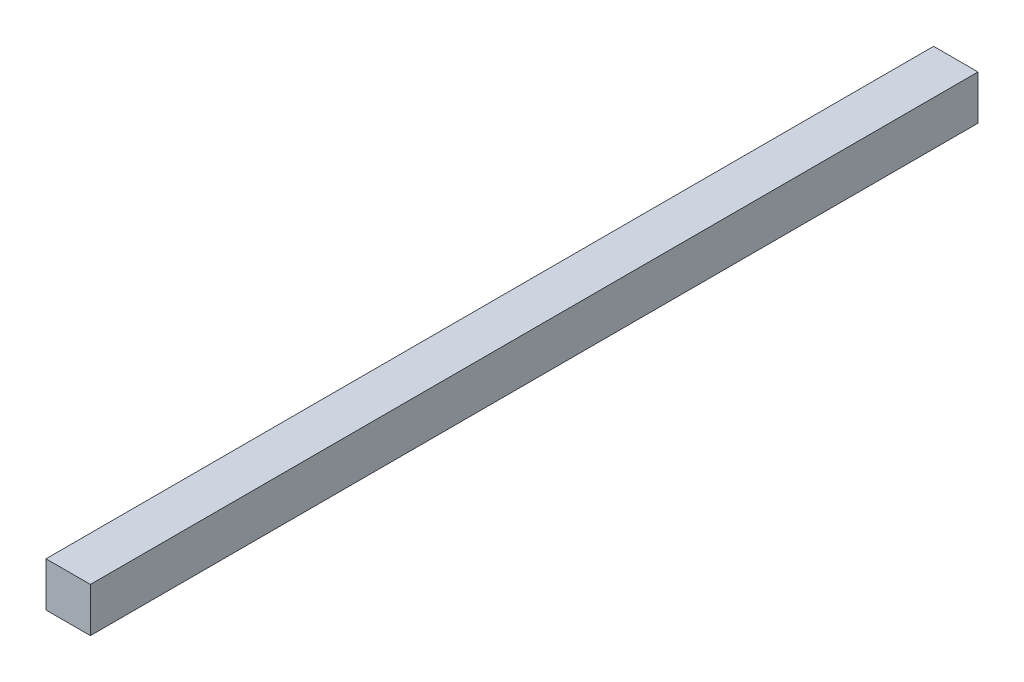
ISO-10303-21;
HEADER;
FILE_DESCRIPTION(('STEP AP214'),'2;1');
FILE_NAME('part.step','',(''),(''),'','','');
FILE_SCHEMA(('AUTOMOTIVE_DESIGN { 1 0 10303 214 1 1 1 1 }'));
ENDSEC;
DATA;
#1=APPLICATION_CONTEXT('core data for automotive mechanical design processes');
#2=APPLICATION_PROTOCOL_DEFINITION('international standard','automotive_design',2000,#1);
#3=PRODUCT_CONTEXT('',#1,'mechanical');
#4=PRODUCT('Part','Part','',(#3));
#5=PRODUCT_RELATED_PRODUCT_CATEGORY('part','',(#4));
#6=PRODUCT_DEFINITION_FORMATION('','',#4);
#7=PRODUCT_DEFINITION_CONTEXT('part definition',#1,'design');
#8=PRODUCT_DEFINITION('design','',#6,#7);
#9=PRODUCT_DEFINITION_SHAPE('','',#8);
#10=(LENGTH_UNIT() NAMED_UNIT(*) SI_UNIT(.MILLI.,.METRE.));
#11=(NAMED_UNIT(*) PLANE_ANGLE_UNIT() SI_UNIT($,.RADIAN.));
#12=(NAMED_UNIT(*) SI_UNIT($,.STERADIAN.) SOLID_ANGLE_UNIT());
#13=UNCERTAINTY_MEASURE_WITH_UNIT(LENGTH_MEASURE(1.E-05),#10,'distance_accuracy_value','');
#14=(GEOMETRIC_REPRESENTATION_CONTEXT(3) GLOBAL_UNCERTAINTY_ASSIGNED_CONTEXT((#13)) GLOBAL_UNIT_ASSIGNED_CONTEXT((#10,
#11,#12)) REPRESENTATION_CONTEXT('',''));
#15=CARTESIAN_POINT('',(0.,0.,0.));
#16=DIRECTION('',(0.,0.,1.));
#17=DIRECTION('',(1.,0.,0.));
#18=AXIS2_PLACEMENT_3D('',#15,#16,#17);
#19=CARTESIAN_POINT('',(-115.,230.,4600.));
#20=DIRECTION('',(1.,0.,0.));
#21=DIRECTION('',(0.,1.,0.));
#22=AXIS2_PLACEMENT_3D('',#19,#20,#21);
#23=PLANE('',#22);
#24=DIRECTION('',(0.,-1.,0.));
#25=VECTOR('',#24,1.);
#26=CARTESIAN_POINT('',(-115.,230.,0.));
#27=LINE('',#26,#25);
#28=CARTESIAN_POINT('',(-115.,230.,0.));
#29=VERTEX_POINT('',#28);
#30=CARTESIAN_POINT('',(-115.,0.,0.));
#31=VERTEX_POINT('',#30);
#32=EDGE_CURVE('E133',#29,#31,#27,.T.);
#33=ORIENTED_EDGE('',*,*,#32,.T.);
#34=DIRECTION('',(0.,0.,-1.));
#35=VECTOR('',#34,1.);
#36=CARTESIAN_POINT('',(-115.,0.,4600.));
#37=LINE('',#36,#35);
#38=CARTESIAN_POINT('',(-115.,0.,4600.));
#39=VERTEX_POINT('',#38);
#40=EDGE_CURVE('E169',#39,#31,#37,.T.);
#41=ORIENTED_EDGE('',*,*,#40,.F.);
#42=DIRECTION('',(0.,-1.,0.));
#43=VECTOR('',#42,1.);
#44=CARTESIAN_POINT('',(-115.,230.,4600.));
#45=LINE('',#44,#43);
#46=CARTESIAN_POINT('',(-115.,230.,4600.));
#47=VERTEX_POINT('',#46);
#48=EDGE_CURVE('E153',#47,#39,#45,.T.);
#49=ORIENTED_EDGE('',*,*,#48,.F.);
#50=DIRECTION('',(0.,0.,-1.));
#51=VECTOR('',#50,1.);
#52=CARTESIAN_POINT('',(-115.,230.,4600.));
#53=LINE('',#52,#51);
#54=EDGE_CURVE('E158',#47,#29,#53,.T.);
#55=ORIENTED_EDGE('',*,*,#54,.T.);
#56=EDGE_LOOP('',(#33,#41,#49,#55));
#57=FACE_BOUND('',#56,.T.);
#58=ADVANCED_FACE('F35',(#57),#23,.F.);
#59=CARTESIAN_POINT('',(-115.,0.,4600.));
#60=DIRECTION('',(0.,1.,0.));
#61=DIRECTION('',(0.,0.,1.));
#62=AXIS2_PLACEMENT_3D('',#59,#60,#61);
#63=PLANE('',#62);
#64=DIRECTION('',(1.,0.,0.));
#65=VECTOR('',#64,1.);
#66=CARTESIAN_POINT('',(-115.,0.,0.));
#67=LINE('',#66,#65);
#68=CARTESIAN_POINT('',(115.,0.,0.));
#69=VERTEX_POINT('',#68);
#70=EDGE_CURVE('E137',#31,#69,#67,.T.);
#71=ORIENTED_EDGE('',*,*,#70,.T.);
#72=DIRECTION('',(0.,0.,-1.));
#73=VECTOR('',#72,1.);
#74=CARTESIAN_POINT('',(115.,0.,4600.));
#75=LINE('',#74,#73);
#76=CARTESIAN_POINT('',(115.,0.,4600.));
#77=VERTEX_POINT('',#76);
#78=EDGE_CURVE('E167',#77,#69,#75,.T.);
#79=ORIENTED_EDGE('',*,*,#78,.F.);
#80=DIRECTION('',(1.,0.,0.));
#81=VECTOR('',#80,1.);
#82=CARTESIAN_POINT('',(-115.,0.,4600.));
#83=LINE('',#82,#81);
#84=EDGE_CURVE('E88',#39,#77,#83,.T.);
#85=ORIENTED_EDGE('',*,*,#84,.F.);
#86=ORIENTED_EDGE('',*,*,#40,.T.);
#87=EDGE_LOOP('',(#71,#79,#85,#86));
#88=FACE_BOUND('',#87,.T.);
#89=ADVANCED_FACE('F188',(#88),#63,.F.);
#90=CARTESIAN_POINT('',(115.,230.,4600.));
#91=DIRECTION('',(-1.,0.,0.));
#92=DIRECTION('',(0.,-1.,0.));
#93=AXIS2_PLACEMENT_3D('',#90,#91,#92);
#94=PLANE('',#93);
#95=DIRECTION('',(0.,1.,0.));
#96=VECTOR('',#95,1.);
#97=CARTESIAN_POINT('',(115.,230.,0.));
#98=LINE('',#97,#96);
#99=CARTESIAN_POINT('',(115.,230.,0.));
#100=VERTEX_POINT('',#99);
#101=EDGE_CURVE('E161',#69,#100,#98,.T.);
#102=ORIENTED_EDGE('',*,*,#101,.T.);
#103=DIRECTION('',(0.,0.,-1.));
#104=VECTOR('',#103,1.);
#105=CARTESIAN_POINT('',(115.,230.,4600.));
#106=LINE('',#105,#104);
#107=CARTESIAN_POINT('',(115.,230.,4600.));
#108=VERTEX_POINT('',#107);
#109=EDGE_CURVE('E165',#108,#100,#106,.T.);
#110=ORIENTED_EDGE('',*,*,#109,.F.);
#111=DIRECTION('',(0.,1.,0.));
#112=VECTOR('',#111,1.);
#113=CARTESIAN_POINT('',(115.,230.,4600.));
#114=LINE('',#113,#112);
#115=EDGE_CURVE('E156',#77,#108,#114,.T.);
#116=ORIENTED_EDGE('',*,*,#115,.F.);
#117=ORIENTED_EDGE('',*,*,#78,.T.);
#118=EDGE_LOOP('',(#102,#110,#116,#117));
#119=FACE_BOUND('',#118,.T.);
#120=ADVANCED_FACE('F193',(#119),#94,.F.);
#121=CARTESIAN_POINT('',(-115.,230.,4600.));
#122=DIRECTION('',(0.,-1.,0.));
#123=DIRECTION('',(1.,0.,0.));
#124=AXIS2_PLACEMENT_3D('',#121,#122,#123);
#125=PLANE('',#124);
#126=DIRECTION('',(-1.,0.,0.));
#127=VECTOR('',#126,1.);
#128=CARTESIAN_POINT('',(-115.,230.,0.));
#129=LINE('',#128,#127);
#130=EDGE_CURVE('E80',#100,#29,#129,.T.);
#131=ORIENTED_EDGE('',*,*,#130,.T.);
#132=ORIENTED_EDGE('',*,*,#54,.F.);
#133=DIRECTION('',(-1.,0.,0.));
#134=VECTOR('',#133,1.);
#135=CARTESIAN_POINT('',(-115.,230.,4600.));
#136=LINE('',#135,#134);
#137=EDGE_CURVE('E59',#108,#47,#136,.T.);
#138=ORIENTED_EDGE('',*,*,#137,.F.);
#139=ORIENTED_EDGE('',*,*,#109,.T.);
#140=EDGE_LOOP('',(#131,#132,#138,#139));
#141=FACE_BOUND('',#140,.T.);
#142=ADVANCED_FACE('F204',(#141),#125,.F.);
#143=CARTESIAN_POINT('',(0.,0.,4600.));
#144=DIRECTION('',(0.,0.,1.));
#145=DIRECTION('',(1.,0.,0.));
#146=AXIS2_PLACEMENT_3D('',#143,#144,#145);
#147=PLANE('',#146);
#148=ORIENTED_EDGE('',*,*,#48,.T.);
#149=ORIENTED_EDGE('',*,*,#84,.T.);
#150=ORIENTED_EDGE('',*,*,#115,.T.);
#151=ORIENTED_EDGE('',*,*,#137,.T.);
#152=EDGE_LOOP('',(#148,#149,#150,#151));
#153=FACE_BOUND('',#152,.T.);
#154=ADVANCED_FACE('F202',(#153),#147,.T.);
#155=CARTESIAN_POINT('',(0.,0.,0.));
#156=DIRECTION('',(0.,0.,1.));
#157=DIRECTION('',(1.,0.,0.));
#158=AXIS2_PLACEMENT_3D('',#155,#156,#157);
#159=PLANE('',#158);
#160=DIRECTION('',(-1.,0.,0.));
#161=VECTOR('',#160,1.);
#162=CARTESIAN_POINT('',(-115.,210.,0.));
#163=LINE('',#162,#161);
#164=CARTESIAN_POINT('',(95.,210.,0.));
#165=VERTEX_POINT('',#164);
#166=CARTESIAN_POINT('',(-95.,210.,0.));
#167=VERTEX_POINT('',#166);
#168=EDGE_CURVE('E128',#165,#167,#163,.T.);
#169=ORIENTED_EDGE('',*,*,#168,.T.);
#170=DIRECTION('',(0.,-1.,0.));
#171=VECTOR('',#170,1.);
#172=CARTESIAN_POINT('',(-95.,230.,0.));
#173=LINE('',#172,#171);
#174=CARTESIAN_POINT('',(-95.,20.,0.));
#175=VERTEX_POINT('',#174);
#176=EDGE_CURVE('E147',#167,#175,#173,.T.);
#177=ORIENTED_EDGE('',*,*,#176,.T.);
#178=DIRECTION('',(1.,0.,0.));
#179=VECTOR('',#178,1.);
#180=CARTESIAN_POINT('',(-115.,20.,0.));
#181=LINE('',#180,#179);
#182=CARTESIAN_POINT('',(95.,20.,0.));
#183=VERTEX_POINT('',#182);
#184=EDGE_CURVE('E132',#175,#183,#181,.T.);
#185=ORIENTED_EDGE('',*,*,#184,.T.);
#186=DIRECTION('',(0.,1.,0.));
#187=VECTOR('',#186,1.);
#188=CARTESIAN_POINT('',(95.,230.,0.));
#189=LINE('',#188,#187);
#190=EDGE_CURVE('E50',#183,#165,#189,.T.);
#191=ORIENTED_EDGE('',*,*,#190,.T.);
#192=EDGE_LOOP('',(#169,#177,#185,#191));
#193=FACE_BOUND('',#192,.T.);
#194=ORIENTED_EDGE('',*,*,#32,.F.);
#195=ORIENTED_EDGE('',*,*,#130,.F.);
#196=ORIENTED_EDGE('',*,*,#101,.F.);
#197=ORIENTED_EDGE('',*,*,#70,.F.);
#198=EDGE_LOOP('',(#194,#195,#196,#197));
#199=FACE_BOUND('',#198,.T.);
#200=ADVANCED_FACE('F197',(#193,#199),#159,.F.);
#201=CARTESIAN_POINT('',(-95.,230.,4600.));
#202=DIRECTION('',(1.,0.,0.));
#203=DIRECTION('',(0.,1.,0.));
#204=AXIS2_PLACEMENT_3D('',#201,#202,#203);
#205=PLANE('',#204);
#206=CARTESIAN_POINT('',(-95.,115.,4050.));
#207=DIRECTION('',(1.,0.,0.));
#208=DIRECTION('',(0.,1.,0.));
#209=AXIS2_PLACEMENT_3D('',#206,#207,#208);
#210=CIRCLE('',#209,25.0000000000005);
#211=CARTESIAN_POINT('',(-95.,140.,4050.));
#212=VERTEX_POINT('',#211);
#213=EDGE_CURVE('E11',#212,#212,#210,.T.);
#214=ORIENTED_EDGE('',*,*,#213,.F.);
#215=EDGE_LOOP('',(#214));
#216=FACE_BOUND('',#215,.T.);
#217=ORIENTED_EDGE('',*,*,#176,.F.);
#218=DIRECTION('',(0.,0.,-1.));
#219=VECTOR('',#218,1.);
#220=CARTESIAN_POINT('',(-95.,210.,4600.));
#221=LINE('',#220,#219);
#222=CARTESIAN_POINT('',(-95.,210.,4580.));
#223=VERTEX_POINT('',#222);
#224=EDGE_CURVE('E127',#223,#167,#221,.T.);
#225=ORIENTED_EDGE('',*,*,#224,.F.);
#226=DIRECTION('',(0.,-1.,0.));
#227=VECTOR('',#226,1.);
#228=CARTESIAN_POINT('',(-95.,230.,4580.));
#229=LINE('',#228,#227);
#230=CARTESIAN_POINT('',(-95.,20.,4580.));
#231=VERTEX_POINT('',#230);
#232=EDGE_CURVE('E115',#223,#231,#229,.T.);
#233=ORIENTED_EDGE('',*,*,#232,.T.);
#234=DIRECTION('',(0.,0.,-1.));
#235=VECTOR('',#234,1.);
#236=CARTESIAN_POINT('',(-95.,20.,4600.));
#237=LINE('',#236,#235);
#238=EDGE_CURVE('E125',#231,#175,#237,.T.);
#239=ORIENTED_EDGE('',*,*,#238,.T.);
#240=EDGE_LOOP('',(#217,#225,#233,#239));
#241=FACE_BOUND('',#240,.T.);
#242=ADVANCED_FACE('F124',(#216,#241),#205,.T.);
#243=CARTESIAN_POINT('',(-115.,20.,4600.));
#244=DIRECTION('',(0.,1.,0.));
#245=DIRECTION('',(0.,0.,1.));
#246=AXIS2_PLACEMENT_3D('',#243,#244,#245);
#247=PLANE('',#246);
#248=ORIENTED_EDGE('',*,*,#184,.F.);
#249=ORIENTED_EDGE('',*,*,#238,.F.);
#250=DIRECTION('',(1.,0.,0.));
#251=VECTOR('',#250,1.);
#252=CARTESIAN_POINT('',(-115.,20.,4580.));
#253=LINE('',#252,#251);
#254=CARTESIAN_POINT('',(95.,20.,4580.));
#255=VERTEX_POINT('',#254);
#256=EDGE_CURVE('E111',#231,#255,#253,.T.);
#257=ORIENTED_EDGE('',*,*,#256,.T.);
#258=DIRECTION('',(0.,0.,-1.));
#259=VECTOR('',#258,1.);
#260=CARTESIAN_POINT('',(95.,20.,4600.));
#261=LINE('',#260,#259);
#262=EDGE_CURVE('E134',#255,#183,#261,.T.);
#263=ORIENTED_EDGE('',*,*,#262,.T.);
#264=EDGE_LOOP('',(#248,#249,#257,#263));
#265=FACE_BOUND('',#264,.T.);
#266=ADVANCED_FACE('F130',(#265),#247,.T.);
#267=CARTESIAN_POINT('',(95.,230.,4600.));
#268=DIRECTION('',(-1.,0.,0.));
#269=DIRECTION('',(0.,-1.,0.));
#270=AXIS2_PLACEMENT_3D('',#267,#268,#269);
#271=PLANE('',#270);
#272=CARTESIAN_POINT('',(95.,115.,4050.));
#273=DIRECTION('',(-1.,0.,0.));
#274=DIRECTION('',(0.,-1.,0.));
#275=AXIS2_PLACEMENT_3D('',#272,#273,#274);
#276=CIRCLE('',#275,25.0000000000005);
#277=CARTESIAN_POINT('',(95.,89.9999999999995,4050.));
#278=VERTEX_POINT('',#277);
#279=EDGE_CURVE('E38',#278,#278,#276,.T.);
#280=ORIENTED_EDGE('',*,*,#279,.F.);
#281=EDGE_LOOP('',(#280));
#282=FACE_BOUND('',#281,.T.);
#283=ORIENTED_EDGE('',*,*,#190,.F.);
#284=ORIENTED_EDGE('',*,*,#262,.F.);
#285=DIRECTION('',(0.,1.,0.));
#286=VECTOR('',#285,1.);
#287=CARTESIAN_POINT('',(95.,230.,4580.));
#288=LINE('',#287,#286);
#289=CARTESIAN_POINT('',(95.,210.,4580.));
#290=VERTEX_POINT('',#289);
#291=EDGE_CURVE('E116',#255,#290,#288,.T.);
#292=ORIENTED_EDGE('',*,*,#291,.T.);
#293=DIRECTION('',(0.,0.,-1.));
#294=VECTOR('',#293,1.);
#295=CARTESIAN_POINT('',(95.,210.,4600.));
#296=LINE('',#295,#294);
#297=EDGE_CURVE('E139',#290,#165,#296,.T.);
#298=ORIENTED_EDGE('',*,*,#297,.T.);
#299=EDGE_LOOP('',(#283,#284,#292,#298));
#300=FACE_BOUND('',#299,.T.);
#301=ADVANCED_FACE('F176',(#282,#300),#271,.T.);
#302=CARTESIAN_POINT('',(-115.,210.,4600.));
#303=DIRECTION('',(0.,-1.,0.));
#304=DIRECTION('',(1.,0.,0.));
#305=AXIS2_PLACEMENT_3D('',#302,#303,#304);
#306=PLANE('',#305);
#307=ORIENTED_EDGE('',*,*,#168,.F.);
#308=ORIENTED_EDGE('',*,*,#297,.F.);
#309=DIRECTION('',(-1.,0.,0.));
#310=VECTOR('',#309,1.);
#311=CARTESIAN_POINT('',(-115.,210.,4580.));
#312=LINE('',#311,#310);
#313=EDGE_CURVE('E142',#290,#223,#312,.T.);
#314=ORIENTED_EDGE('',*,*,#313,.T.);
#315=ORIENTED_EDGE('',*,*,#224,.T.);
#316=EDGE_LOOP('',(#307,#308,#314,#315));
#317=FACE_BOUND('',#316,.T.);
#318=ADVANCED_FACE('F178',(#317),#306,.T.);
#319=CARTESIAN_POINT('',(0.,0.,4580.));
#320=DIRECTION('',(0.,0.,1.));
#321=DIRECTION('',(1.,0.,0.));
#322=AXIS2_PLACEMENT_3D('',#319,#320,#321);
#323=PLANE('',#322);
#324=ORIENTED_EDGE('',*,*,#232,.F.);
#325=ORIENTED_EDGE('',*,*,#313,.F.);
#326=ORIENTED_EDGE('',*,*,#291,.F.);
#327=ORIENTED_EDGE('',*,*,#256,.F.);
#328=EDGE_LOOP('',(#324,#325,#326,#327));
#329=FACE_BOUND('',#328,.T.);
#330=ADVANCED_FACE('F113',(#329),#323,.F.);
#331=CARTESIAN_POINT('',(-115.,115.,4050.));
#332=DIRECTION('',(1.,0.,0.));
#333=DIRECTION('',(0.,1.,0.));
#334=AXIS2_PLACEMENT_3D('',#331,#332,#333);
#335=CYLINDRICAL_SURFACE('',#334,25.0000000000005);
#336=ORIENTED_EDGE('',*,*,#213,.T.);
#337=EDGE_LOOP('',(#336));
#338=FACE_BOUND('',#337,.T.);
#339=ORIENTED_EDGE('',*,*,#279,.T.);
#340=EDGE_LOOP('',(#339));
#341=FACE_BOUND('',#340,.T.);
#342=ADVANCED_FACE('F174',(#338,#341),#335,.T.);
#343=CLOSED_SHELL('',(#58,#89,#120,#142,#154,#200,#242,#266,#301,#318,#330,#342));
#344=MANIFOLD_SOLID_BREP('B2',#343);
#345=ADVANCED_BREP_SHAPE_REPRESENTATION('',(#18,#344),#14);
#346=SHAPE_DEFINITION_REPRESENTATION(#9,#345);
ENDSEC;
END-ISO-10303-21;
